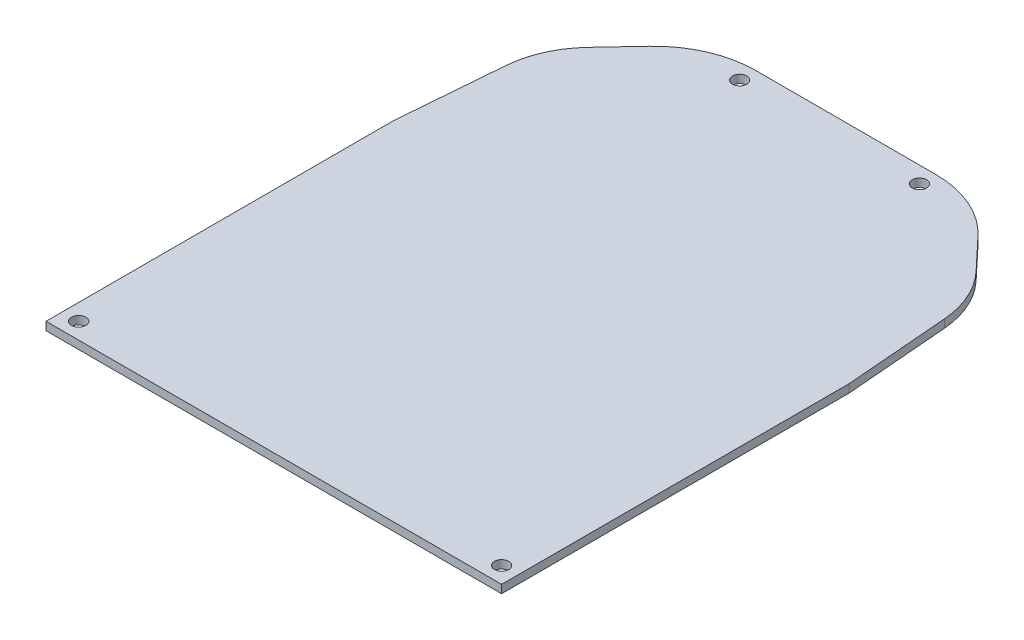
ISO-10303-21;
HEADER;
FILE_DESCRIPTION(('STEP AP214'),'2;1');
FILE_NAME('part.step','',(''),(''),'','','');
FILE_SCHEMA(('AUTOMOTIVE_DESIGN { 1 0 10303 214 1 1 1 1 }'));
ENDSEC;
DATA;
#1=APPLICATION_CONTEXT('core data for automotive mechanical design processes');
#2=APPLICATION_PROTOCOL_DEFINITION('international standard','automotive_design',2000,#1);
#3=PRODUCT_CONTEXT('',#1,'mechanical');
#4=PRODUCT('Part','Part','',(#3));
#5=PRODUCT_RELATED_PRODUCT_CATEGORY('part','',(#4));
#6=PRODUCT_DEFINITION_FORMATION('','',#4);
#7=PRODUCT_DEFINITION_CONTEXT('part definition',#1,'design');
#8=PRODUCT_DEFINITION('design','',#6,#7);
#9=PRODUCT_DEFINITION_SHAPE('','',#8);
#10=(LENGTH_UNIT() NAMED_UNIT(*) SI_UNIT(.MILLI.,.METRE.));
#11=(NAMED_UNIT(*) PLANE_ANGLE_UNIT() SI_UNIT($,.RADIAN.));
#12=(NAMED_UNIT(*) SI_UNIT($,.STERADIAN.) SOLID_ANGLE_UNIT());
#13=UNCERTAINTY_MEASURE_WITH_UNIT(LENGTH_MEASURE(1.E-05),#10,'distance_accuracy_value','');
#14=(GEOMETRIC_REPRESENTATION_CONTEXT(3) GLOBAL_UNCERTAINTY_ASSIGNED_CONTEXT((#13)) GLOBAL_UNIT_ASSIGNED_CONTEXT((#10,
#11,#12)) REPRESENTATION_CONTEXT('',''));
#15=CARTESIAN_POINT('',(0.,0.,0.));
#16=DIRECTION('',(0.,0.,1.));
#17=DIRECTION('',(1.,0.,0.));
#18=AXIS2_PLACEMENT_3D('',#15,#16,#17);
#19=CARTESIAN_POINT('',(-52.3564557576918,2.,-49.20418799964));
#20=DIRECTION('',(0.728703237176436,0.,0.684829608098674));
#21=DIRECTION('',(0.684829608098674,0.,-0.728703237176436));
#22=AXIS2_PLACEMENT_3D('',#19,#20,#21);
#23=PLANE('',#22);
#24=DIRECTION('',(-0.684829608098674,0.,0.728703237176436));
#25=VECTOR('',#24,1.);
#26=CARTESIAN_POINT('',(-52.3564557576918,0.,-49.20418799964));
#27=LINE('',#26,#25);
#28=CARTESIAN_POINT('',(-40.2175809294112,0.,-62.1207402024664));
#29=VERTEX_POINT('',#28);
#30=CARTESIAN_POINT('',(-47.510174455058,0.,-54.3609464571219));
#31=VERTEX_POINT('',#30);
#32=EDGE_CURVE('E172',#29,#31,#27,.T.);
#33=ORIENTED_EDGE('',*,*,#32,.T.);
#34=DIRECTION('',(0.,-1.,0.));
#35=VECTOR('',#34,1.);
#36=CARTESIAN_POINT('',(-47.510174455058,2.,-54.3609464571219));
#37=LINE('',#36,#35);
#38=CARTESIAN_POINT('',(-47.510174455058,2.,-54.3609464571219));
#39=VERTEX_POINT('',#38);
#40=EDGE_CURVE('E11',#39,#31,#37,.T.);
#41=ORIENTED_EDGE('',*,*,#40,.F.);
#42=DIRECTION('',(-0.684829608098674,0.,0.728703237176436));
#43=VECTOR('',#42,1.);
#44=CARTESIAN_POINT('',(-52.3564557576918,2.,-49.20418799964));
#45=LINE('',#44,#43);
#46=CARTESIAN_POINT('',(-40.2175809294112,2.,-62.1207402024664));
#47=VERTEX_POINT('',#46);
#48=EDGE_CURVE('E268',#47,#39,#45,.T.);
#49=ORIENTED_EDGE('',*,*,#48,.F.);
#50=DIRECTION('',(0.,-1.,0.));
#51=VECTOR('',#50,1.);
#52=CARTESIAN_POINT('',(-40.2175809294112,2.,-62.1207402024664));
#53=LINE('',#52,#51);
#54=EDGE_CURVE('E165',#47,#29,#53,.T.);
#55=ORIENTED_EDGE('',*,*,#54,.T.);
#56=EDGE_LOOP('',(#33,#41,#49,#55));
#57=FACE_BOUND('',#56,.T.);
#58=ADVANCED_FACE('F38',(#57),#23,.F.);
#59=CARTESIAN_POINT('',(-30.7500000000001,2.,-38.6098654708518));
#60=DIRECTION('',(0.,-1.,0.));
#61=DIRECTION('',(0.,0.,-1.));
#62=AXIS2_PLACEMENT_3D('',#59,#60,#61);
#63=CYLINDRICAL_SURFACE('',#62,23.0000000000002);
#64=CARTESIAN_POINT('',(-30.7500000000001,0.,-38.6098654708518));
#65=DIRECTION('',(0.,1.,0.));
#66=DIRECTION('',(0.,0.,1.));
#67=AXIS2_PLACEMENT_3D('',#64,#65,#66);
#68=CIRCLE('',#67,23.0000000000002);
#69=CARTESIAN_POINT('',(-53.6740263210606,0.,-40.4777565895551));
#70=VERTEX_POINT('',#69);
#71=EDGE_CURVE('E175',#31,#70,#68,.T.);
#72=ORIENTED_EDGE('',*,*,#71,.T.);
#73=DIRECTION('',(0.,-1.,0.));
#74=VECTOR('',#73,1.);
#75=CARTESIAN_POINT('',(-53.6740263210606,2.,-40.4777565895551));
#76=LINE('',#75,#74);
#77=CARTESIAN_POINT('',(-53.6740263210606,2.,-40.4777565895551));
#78=VERTEX_POINT('',#77);
#79=EDGE_CURVE('E47',#78,#70,#76,.T.);
#80=ORIENTED_EDGE('',*,*,#79,.F.);
#81=CARTESIAN_POINT('',(-30.7500000000001,2.,-38.6098654708518));
#82=DIRECTION('',(0.,1.,0.));
#83=DIRECTION('',(0.,0.,1.));
#84=AXIS2_PLACEMENT_3D('',#81,#82,#83);
#85=CIRCLE('',#84,23.0000000000002);
#86=EDGE_CURVE('E110',#39,#78,#85,.T.);
#87=ORIENTED_EDGE('',*,*,#86,.F.);
#88=ORIENTED_EDGE('',*,*,#40,.T.);
#89=EDGE_LOOP('',(#72,#80,#87,#88));
#90=FACE_BOUND('',#89,.T.);
#91=ADVANCED_FACE('F283',(#90),#63,.T.);
#92=CARTESIAN_POINT('',(-56.5964670451986,2.,-4.61158247958299));
#93=DIRECTION('',(0.996696796567843,0.,0.0812126573349192));
#94=DIRECTION('',(0.0812126573349192,0.,-0.996696796567843));
#95=AXIS2_PLACEMENT_3D('',#92,#93,#94);
#96=PLANE('',#95);
#97=DIRECTION('',(-0.0812126573349192,0.,0.996696796567843));
#98=VECTOR('',#97,1.);
#99=CARTESIAN_POINT('',(-56.5964670451986,0.,-4.61158247958299));
#100=LINE('',#99,#98);
#101=CARTESIAN_POINT('',(-55.75,0.,-15.0000000001471));
#102=VERTEX_POINT('',#101);
#103=EDGE_CURVE('E177',#70,#102,#100,.T.);
#104=ORIENTED_EDGE('',*,*,#103,.T.);
#105=DIRECTION('',(0.,-1.,0.));
#106=VECTOR('',#105,1.);
#107=CARTESIAN_POINT('',(-55.75,2.,-15.0000000001471));
#108=LINE('',#107,#106);
#109=CARTESIAN_POINT('',(-55.75,2.,-15.0000000001471));
#110=VERTEX_POINT('',#109);
#111=EDGE_CURVE('E219',#110,#102,#108,.T.);
#112=ORIENTED_EDGE('',*,*,#111,.F.);
#113=DIRECTION('',(-0.0812126573349192,0.,0.996696796567843));
#114=VECTOR('',#113,1.);
#115=CARTESIAN_POINT('',(-56.5964670451986,2.,-4.61158247958299));
#116=LINE('',#115,#114);
#117=EDGE_CURVE('E227',#78,#110,#116,.T.);
#118=ORIENTED_EDGE('',*,*,#117,.F.);
#119=ORIENTED_EDGE('',*,*,#79,.T.);
#120=EDGE_LOOP('',(#104,#112,#118,#119));
#121=FACE_BOUND('',#120,.T.);
#122=ADVANCED_FACE('F225',(#121),#96,.F.);
#123=CARTESIAN_POINT('',(-55.75,2.,0.));
#124=DIRECTION('',(1.,0.,0.));
#125=DIRECTION('',(0.,0.,-1.));
#126=AXIS2_PLACEMENT_3D('',#123,#124,#125);
#127=PLANE('',#126);
#128=DIRECTION('',(0.,0.,1.));
#129=VECTOR('',#128,1.);
#130=CARTESIAN_POINT('',(-55.75,0.,0.));
#131=LINE('',#130,#129);
#132=CARTESIAN_POINT('',(-55.75,0.,69.9999999999999));
#133=VERTEX_POINT('',#132);
#134=EDGE_CURVE('E179',#102,#133,#131,.T.);
#135=ORIENTED_EDGE('',*,*,#134,.T.);
#136=DIRECTION('',(0.,-1.,0.));
#137=VECTOR('',#136,1.);
#138=CARTESIAN_POINT('',(-55.75,2.,69.9999999999999));
#139=LINE('',#138,#137);
#140=CARTESIAN_POINT('',(-55.75,2.,69.9999999999999));
#141=VERTEX_POINT('',#140);
#142=EDGE_CURVE('E216',#141,#133,#139,.T.);
#143=ORIENTED_EDGE('',*,*,#142,.F.);
#144=DIRECTION('',(0.,0.,1.));
#145=VECTOR('',#144,1.);
#146=CARTESIAN_POINT('',(-55.75,2.,0.));
#147=LINE('',#146,#145);
#148=EDGE_CURVE('E246',#110,#141,#147,.T.);
#149=ORIENTED_EDGE('',*,*,#148,.F.);
#150=ORIENTED_EDGE('',*,*,#111,.T.);
#151=EDGE_LOOP('',(#135,#143,#149,#150));
#152=FACE_BOUND('',#151,.T.);
#153=ADVANCED_FACE('F237',(#152),#127,.F.);
#154=CARTESIAN_POINT('',(0.,2.,69.9999999999999));
#155=DIRECTION('',(0.,0.,-1.));
#156=DIRECTION('',(-1.,0.,0.));
#157=AXIS2_PLACEMENT_3D('',#154,#155,#156);
#158=PLANE('',#157);
#159=DIRECTION('',(1.,0.,0.));
#160=VECTOR('',#159,1.);
#161=CARTESIAN_POINT('',(0.,0.,69.9999999999999));
#162=LINE('',#161,#160);
#163=CARTESIAN_POINT('',(55.75,0.,69.9999999999999));
#164=VERTEX_POINT('',#163);
#165=EDGE_CURVE('E181',#133,#164,#162,.T.);
#166=ORIENTED_EDGE('',*,*,#165,.T.);
#167=DIRECTION('',(0.,-1.,0.));
#168=VECTOR('',#167,1.);
#169=CARTESIAN_POINT('',(55.75,2.,69.9999999999999));
#170=LINE('',#169,#168);
#171=CARTESIAN_POINT('',(55.75,2.,69.9999999999999));
#172=VERTEX_POINT('',#171);
#173=EDGE_CURVE('E213',#172,#164,#170,.T.);
#174=ORIENTED_EDGE('',*,*,#173,.F.);
#175=DIRECTION('',(1.,0.,0.));
#176=VECTOR('',#175,1.);
#177=CARTESIAN_POINT('',(0.,2.,69.9999999999999));
#178=LINE('',#177,#176);
#179=EDGE_CURVE('E243',#141,#172,#178,.T.);
#180=ORIENTED_EDGE('',*,*,#179,.F.);
#181=ORIENTED_EDGE('',*,*,#142,.T.);
#182=EDGE_LOOP('',(#166,#174,#180,#181));
#183=FACE_BOUND('',#182,.T.);
#184=ADVANCED_FACE('F241',(#183),#158,.F.);
#185=CARTESIAN_POINT('',(55.75,2.,0.));
#186=DIRECTION('',(-1.,0.,0.));
#187=DIRECTION('',(0.,0.,1.));
#188=AXIS2_PLACEMENT_3D('',#185,#186,#187);
#189=PLANE('',#188);
#190=DIRECTION('',(0.,0.,-1.));
#191=VECTOR('',#190,1.);
#192=CARTESIAN_POINT('',(55.75,0.,0.));
#193=LINE('',#192,#191);
#194=CARTESIAN_POINT('',(55.75,0.,-15.000000000147));
#195=VERTEX_POINT('',#194);
#196=EDGE_CURVE('E183',#164,#195,#193,.T.);
#197=ORIENTED_EDGE('',*,*,#196,.T.);
#198=DIRECTION('',(0.,-1.,0.));
#199=VECTOR('',#198,1.);
#200=CARTESIAN_POINT('',(55.75,2.,-15.000000000147));
#201=LINE('',#200,#199);
#202=CARTESIAN_POINT('',(55.75,2.,-15.000000000147));
#203=VERTEX_POINT('',#202);
#204=EDGE_CURVE('E210',#203,#195,#201,.T.);
#205=ORIENTED_EDGE('',*,*,#204,.F.);
#206=DIRECTION('',(0.,0.,-1.));
#207=VECTOR('',#206,1.);
#208=CARTESIAN_POINT('',(55.75,2.,0.));
#209=LINE('',#208,#207);
#210=EDGE_CURVE('E245',#172,#203,#209,.T.);
#211=ORIENTED_EDGE('',*,*,#210,.F.);
#212=ORIENTED_EDGE('',*,*,#173,.T.);
#213=EDGE_LOOP('',(#197,#205,#211,#212));
#214=FACE_BOUND('',#213,.T.);
#215=ADVANCED_FACE('F296',(#214),#189,.F.);
#216=CARTESIAN_POINT('',(56.5964670451985,2.,-4.61158247958297));
#217=DIRECTION('',(-0.996696796567843,0.,0.0812126573349188));
#218=DIRECTION('',(0.0812126573349189,0.,0.996696796567844));
#219=AXIS2_PLACEMENT_3D('',#216,#217,#218);
#220=PLANE('',#219);
#221=DIRECTION('',(-0.0812126573349189,0.,-0.996696796567844));
#222=VECTOR('',#221,1.);
#223=CARTESIAN_POINT('',(56.5964670451985,0.,-4.61158247958297));
#224=LINE('',#223,#222);
#225=CARTESIAN_POINT('',(53.6740263210606,0.,-40.4777565895551));
#226=VERTEX_POINT('',#225);
#227=EDGE_CURVE('E185',#195,#226,#224,.T.);
#228=ORIENTED_EDGE('',*,*,#227,.T.);
#229=DIRECTION('',(0.,-1.,0.));
#230=VECTOR('',#229,1.);
#231=CARTESIAN_POINT('',(53.6740263210606,2.,-40.4777565895551));
#232=LINE('',#231,#230);
#233=CARTESIAN_POINT('',(53.6740263210606,2.,-40.4777565895551));
#234=VERTEX_POINT('',#233);
#235=EDGE_CURVE('E207',#234,#226,#232,.T.);
#236=ORIENTED_EDGE('',*,*,#235,.F.);
#237=DIRECTION('',(-0.0812126573349189,0.,-0.996696796567844));
#238=VECTOR('',#237,1.);
#239=CARTESIAN_POINT('',(56.5964670451985,2.,-4.61158247958297));
#240=LINE('',#239,#238);
#241=EDGE_CURVE('E248',#203,#234,#240,.T.);
#242=ORIENTED_EDGE('',*,*,#241,.F.);
#243=ORIENTED_EDGE('',*,*,#204,.T.);
#244=EDGE_LOOP('',(#228,#236,#242,#243));
#245=FACE_BOUND('',#244,.T.);
#246=ADVANCED_FACE('F299',(#245),#220,.F.);
#247=CARTESIAN_POINT('',(30.7499999999991,2.,-38.6098654708517));
#248=DIRECTION('',(0.,-1.,0.));
#249=DIRECTION('',(0.,0.,-1.));
#250=AXIS2_PLACEMENT_3D('',#247,#248,#249);
#251=CYLINDRICAL_SURFACE('',#250,23.0000000000011);
#252=CARTESIAN_POINT('',(30.7499999999991,0.,-38.6098654708517));
#253=DIRECTION('',(0.,1.,0.));
#254=DIRECTION('',(0.,0.,1.));
#255=AXIS2_PLACEMENT_3D('',#252,#253,#254);
#256=CIRCLE('',#255,23.0000000000011);
#257=CARTESIAN_POINT('',(47.510174455058,0.,-54.3609464571219));
#258=VERTEX_POINT('',#257);
#259=EDGE_CURVE('E187',#226,#258,#256,.T.);
#260=ORIENTED_EDGE('',*,*,#259,.T.);
#261=DIRECTION('',(0.,-1.,0.));
#262=VECTOR('',#261,1.);
#263=CARTESIAN_POINT('',(47.510174455058,2.,-54.3609464571219));
#264=LINE('',#263,#262);
#265=CARTESIAN_POINT('',(47.510174455058,2.,-54.3609464571219));
#266=VERTEX_POINT('',#265);
#267=EDGE_CURVE('E204',#266,#258,#264,.T.);
#268=ORIENTED_EDGE('',*,*,#267,.F.);
#269=CARTESIAN_POINT('',(30.7499999999991,2.,-38.6098654708517));
#270=DIRECTION('',(0.,1.,0.));
#271=DIRECTION('',(0.,0.,1.));
#272=AXIS2_PLACEMENT_3D('',#269,#270,#271);
#273=CIRCLE('',#272,23.0000000000011);
#274=EDGE_CURVE('E254',#234,#266,#273,.T.);
#275=ORIENTED_EDGE('',*,*,#274,.F.);
#276=ORIENTED_EDGE('',*,*,#235,.T.);
#277=EDGE_LOOP('',(#260,#268,#275,#276));
#278=FACE_BOUND('',#277,.T.);
#279=ADVANCED_FACE('F260',(#278),#251,.T.);
#280=CARTESIAN_POINT('',(52.3564557576921,2.,-49.2041879996396));
#281=DIRECTION('',(-0.72870323717644,0.,0.684829608098669));
#282=DIRECTION('',(0.684829608098669,0.,0.72870323717644));
#283=AXIS2_PLACEMENT_3D('',#280,#281,#282);
#284=PLANE('',#283);
#285=DIRECTION('',(-0.684829608098669,0.,-0.72870323717644));
#286=VECTOR('',#285,1.);
#287=CARTESIAN_POINT('',(52.3564557576921,0.,-49.2041879996396));
#288=LINE('',#287,#286);
#289=CARTESIAN_POINT('',(40.2175809294109,0.,-62.1207402024667));
#290=VERTEX_POINT('',#289);
#291=EDGE_CURVE('E189',#258,#290,#288,.T.);
#292=ORIENTED_EDGE('',*,*,#291,.T.);
#293=DIRECTION('',(0.,-1.,0.));
#294=VECTOR('',#293,1.);
#295=CARTESIAN_POINT('',(40.2175809294109,2.,-62.1207402024667));
#296=LINE('',#295,#294);
#297=CARTESIAN_POINT('',(40.2175809294109,2.,-62.1207402024667));
#298=VERTEX_POINT('',#297);
#299=EDGE_CURVE('E151',#298,#290,#296,.T.);
#300=ORIENTED_EDGE('',*,*,#299,.F.);
#301=DIRECTION('',(-0.684829608098669,0.,-0.72870323717644));
#302=VECTOR('',#301,1.);
#303=CARTESIAN_POINT('',(52.3564557576921,2.,-49.2041879996396));
#304=LINE('',#303,#302);
#305=EDGE_CURVE('E142',#266,#298,#304,.T.);
#306=ORIENTED_EDGE('',*,*,#305,.F.);
#307=ORIENTED_EDGE('',*,*,#267,.T.);
#308=EDGE_LOOP('',(#292,#300,#306,#307));
#309=FACE_BOUND('',#308,.T.);
#310=ADVANCED_FACE('F264',(#309),#284,.F.);
#311=CARTESIAN_POINT('',(22.,2.,-45.));
#312=DIRECTION('',(0.,-1.,0.));
#313=DIRECTION('',(0.,0.,-1.));
#314=AXIS2_PLACEMENT_3D('',#311,#312,#313);
#315=CYLINDRICAL_SURFACE('',#314,25.);
#316=CARTESIAN_POINT('',(22.,0.,-45.));
#317=DIRECTION('',(0.,1.,0.));
#318=DIRECTION('',(0.,0.,1.));
#319=AXIS2_PLACEMENT_3D('',#316,#317,#318);
#320=CIRCLE('',#319,25.);
#321=CARTESIAN_POINT('',(22.,0.,-70.));
#322=VERTEX_POINT('',#321);
#323=EDGE_CURVE('E150',#290,#322,#320,.T.);
#324=ORIENTED_EDGE('',*,*,#323,.T.);
#325=DIRECTION('',(0.,-1.,0.));
#326=VECTOR('',#325,1.);
#327=CARTESIAN_POINT('',(22.,2.,-70.));
#328=LINE('',#327,#326);
#329=CARTESIAN_POINT('',(22.,2.,-70.));
#330=VERTEX_POINT('',#329);
#331=EDGE_CURVE('E147',#330,#322,#328,.T.);
#332=ORIENTED_EDGE('',*,*,#331,.F.);
#333=CARTESIAN_POINT('',(22.,2.,-45.));
#334=DIRECTION('',(0.,1.,0.));
#335=DIRECTION('',(0.,0.,1.));
#336=AXIS2_PLACEMENT_3D('',#333,#334,#335);
#337=CIRCLE('',#336,25.);
#338=EDGE_CURVE('E135',#298,#330,#337,.T.);
#339=ORIENTED_EDGE('',*,*,#338,.F.);
#340=ORIENTED_EDGE('',*,*,#299,.T.);
#341=EDGE_LOOP('',(#324,#332,#339,#340));
#342=FACE_BOUND('',#341,.T.);
#343=ADVANCED_FACE('F148',(#342),#315,.T.);
#344=CARTESIAN_POINT('',(0.,2.,-70.));
#345=DIRECTION('',(0.,0.,1.));
#346=DIRECTION('',(1.,0.,0.));
#347=AXIS2_PLACEMENT_3D('',#344,#345,#346);
#348=PLANE('',#347);
#349=DIRECTION('',(-1.,0.,0.));
#350=VECTOR('',#349,1.);
#351=CARTESIAN_POINT('',(0.,0.,-70.));
#352=LINE('',#351,#350);
#353=CARTESIAN_POINT('',(-21.9999999999998,0.,-70.));
#354=VERTEX_POINT('',#353);
#355=EDGE_CURVE('E96',#322,#354,#352,.T.);
#356=ORIENTED_EDGE('',*,*,#355,.T.);
#357=DIRECTION('',(0.,-1.,0.));
#358=VECTOR('',#357,1.);
#359=CARTESIAN_POINT('',(-21.9999999999998,2.,-70.));
#360=LINE('',#359,#358);
#361=CARTESIAN_POINT('',(-21.9999999999998,2.,-70.));
#362=VERTEX_POINT('',#361);
#363=EDGE_CURVE('E152',#362,#354,#360,.T.);
#364=ORIENTED_EDGE('',*,*,#363,.F.);
#365=DIRECTION('',(-1.,0.,0.));
#366=VECTOR('',#365,1.);
#367=CARTESIAN_POINT('',(0.,2.,-70.));
#368=LINE('',#367,#366);
#369=EDGE_CURVE('E140',#330,#362,#368,.T.);
#370=ORIENTED_EDGE('',*,*,#369,.F.);
#371=ORIENTED_EDGE('',*,*,#331,.T.);
#372=EDGE_LOOP('',(#356,#364,#370,#371));
#373=FACE_BOUND('',#372,.T.);
#374=ADVANCED_FACE('F154',(#373),#348,.F.);
#375=CARTESIAN_POINT('',(-51.75,2.,66.));
#376=DIRECTION('',(0.,-1.,0.));
#377=DIRECTION('',(0.,0.,-1.));
#378=AXIS2_PLACEMENT_3D('',#375,#376,#377);
#379=CYLINDRICAL_SURFACE('',#378,1.75);
#380=CARTESIAN_POINT('',(-51.75,2.,66.));
#381=DIRECTION('',(0.,1.,0.));
#382=DIRECTION('',(0.,0.,1.));
#383=AXIS2_PLACEMENT_3D('',#380,#381,#382);
#384=CIRCLE('',#383,1.75);
#385=CARTESIAN_POINT('',(-51.75,2.,67.75));
#386=VERTEX_POINT('',#385);
#387=EDGE_CURVE('E156',#386,#386,#384,.T.);
#388=ORIENTED_EDGE('',*,*,#387,.T.);
#389=EDGE_LOOP('',(#388));
#390=FACE_BOUND('',#389,.T.);
#391=CARTESIAN_POINT('',(-51.75,0.,66.));
#392=DIRECTION('',(0.,1.,0.));
#393=DIRECTION('',(0.,0.,1.));
#394=AXIS2_PLACEMENT_3D('',#391,#392,#393);
#395=CIRCLE('',#394,1.75);
#396=CARTESIAN_POINT('',(-51.75,0.,67.75));
#397=VERTEX_POINT('',#396);
#398=EDGE_CURVE('E194',#397,#397,#395,.T.);
#399=ORIENTED_EDGE('',*,*,#398,.F.);
#400=EDGE_LOOP('',(#399));
#401=FACE_BOUND('',#400,.T.);
#402=ADVANCED_FACE('F272',(#390,#401),#379,.F.);
#403=CARTESIAN_POINT('',(-21.9999999999998,2.,-44.9999999999999));
#404=DIRECTION('',(0.,-1.,0.));
#405=DIRECTION('',(0.,0.,-1.));
#406=AXIS2_PLACEMENT_3D('',#403,#404,#405);
#407=CYLINDRICAL_SURFACE('',#406,25.0000000000001);
#408=CARTESIAN_POINT('',(-21.9999999999998,0.,-44.9999999999999));
#409=DIRECTION('',(0.,1.,0.));
#410=DIRECTION('',(0.,0.,1.));
#411=AXIS2_PLACEMENT_3D('',#408,#409,#410);
#412=CIRCLE('',#411,25.0000000000001);
#413=EDGE_CURVE('E102',#354,#29,#412,.T.);
#414=ORIENTED_EDGE('',*,*,#413,.T.);
#415=ORIENTED_EDGE('',*,*,#54,.F.);
#416=CARTESIAN_POINT('',(-21.9999999999998,2.,-44.9999999999999));
#417=DIRECTION('',(0.,1.,0.));
#418=DIRECTION('',(0.,0.,1.));
#419=AXIS2_PLACEMENT_3D('',#416,#417,#418);
#420=CIRCLE('',#419,25.0000000000001);
#421=EDGE_CURVE('E55',#362,#47,#420,.T.);
#422=ORIENTED_EDGE('',*,*,#421,.F.);
#423=ORIENTED_EDGE('',*,*,#363,.T.);
#424=EDGE_LOOP('',(#414,#415,#422,#423));
#425=FACE_BOUND('',#424,.T.);
#426=ADVANCED_FACE('F269',(#425),#407,.T.);
#427=CARTESIAN_POINT('',(-22.,2.,-66.));
#428=DIRECTION('',(0.,-1.,0.));
#429=DIRECTION('',(0.,0.,-1.));
#430=AXIS2_PLACEMENT_3D('',#427,#428,#429);
#431=CYLINDRICAL_SURFACE('',#430,1.75);
#432=CARTESIAN_POINT('',(-22.,2.,-66.));
#433=DIRECTION('',(0.,1.,0.));
#434=DIRECTION('',(0.,0.,1.));
#435=AXIS2_PLACEMENT_3D('',#432,#433,#434);
#436=CIRCLE('',#435,1.75);
#437=CARTESIAN_POINT('',(-22.,2.,-64.25));
#438=VERTEX_POINT('',#437);
#439=EDGE_CURVE('E384',#438,#438,#436,.T.);
#440=ORIENTED_EDGE('',*,*,#439,.T.);
#441=EDGE_LOOP('',(#440));
#442=FACE_BOUND('',#441,.T.);
#443=CARTESIAN_POINT('',(-22.,0.,-66.));
#444=DIRECTION('',(0.,1.,0.));
#445=DIRECTION('',(0.,0.,1.));
#446=AXIS2_PLACEMENT_3D('',#443,#444,#445);
#447=CIRCLE('',#446,1.75);
#448=CARTESIAN_POINT('',(-22.,0.,-64.25));
#449=VERTEX_POINT('',#448);
#450=EDGE_CURVE('E169',#449,#449,#447,.T.);
#451=ORIENTED_EDGE('',*,*,#450,.F.);
#452=EDGE_LOOP('',(#451));
#453=FACE_BOUND('',#452,.T.);
#454=ADVANCED_FACE('F271',(#442,#453),#431,.F.);
#455=CARTESIAN_POINT('',(22.,2.,-66.));
#456=DIRECTION('',(0.,-1.,0.));
#457=DIRECTION('',(0.,0.,-1.));
#458=AXIS2_PLACEMENT_3D('',#455,#456,#457);
#459=CYLINDRICAL_SURFACE('',#458,1.75);
#460=CARTESIAN_POINT('',(22.,2.,-66.));
#461=DIRECTION('',(0.,1.,0.));
#462=DIRECTION('',(0.,0.,1.));
#463=AXIS2_PLACEMENT_3D('',#460,#461,#462);
#464=CIRCLE('',#463,1.75);
#465=CARTESIAN_POINT('',(22.,2.,-64.25));
#466=VERTEX_POINT('',#465);
#467=EDGE_CURVE('E200',#466,#466,#464,.T.);
#468=ORIENTED_EDGE('',*,*,#467,.T.);
#469=EDGE_LOOP('',(#468));
#470=FACE_BOUND('',#469,.T.);
#471=CARTESIAN_POINT('',(22.,0.,-66.));
#472=DIRECTION('',(0.,1.,0.));
#473=DIRECTION('',(0.,0.,1.));
#474=AXIS2_PLACEMENT_3D('',#471,#472,#473);
#475=CIRCLE('',#474,1.75);
#476=CARTESIAN_POINT('',(22.,0.,-64.25));
#477=VERTEX_POINT('',#476);
#478=EDGE_CURVE('E166',#477,#477,#475,.T.);
#479=ORIENTED_EDGE('',*,*,#478,.F.);
#480=EDGE_LOOP('',(#479));
#481=FACE_BOUND('',#480,.T.);
#482=ADVANCED_FACE('F40',(#470,#481),#459,.F.);
#483=CARTESIAN_POINT('',(51.75,2.,65.9999999999999));
#484=DIRECTION('',(0.,-1.,0.));
#485=DIRECTION('',(0.,0.,-1.));
#486=AXIS2_PLACEMENT_3D('',#483,#484,#485);
#487=CYLINDRICAL_SURFACE('',#486,1.75);
#488=CARTESIAN_POINT('',(51.75,2.,65.9999999999999));
#489=DIRECTION('',(0.,1.,0.));
#490=DIRECTION('',(0.,0.,1.));
#491=AXIS2_PLACEMENT_3D('',#488,#489,#490);
#492=CIRCLE('',#491,1.75);
#493=CARTESIAN_POINT('',(51.75,2.,67.7499999999999));
#494=VERTEX_POINT('',#493);
#495=EDGE_CURVE('E162',#494,#494,#492,.T.);
#496=ORIENTED_EDGE('',*,*,#495,.T.);
#497=EDGE_LOOP('',(#496));
#498=FACE_BOUND('',#497,.T.);
#499=CARTESIAN_POINT('',(51.75,0.,65.9999999999999));
#500=DIRECTION('',(0.,1.,0.));
#501=DIRECTION('',(0.,0.,1.));
#502=AXIS2_PLACEMENT_3D('',#499,#500,#501);
#503=CIRCLE('',#502,1.75);
#504=CARTESIAN_POINT('',(51.75,0.,67.7499999999999));
#505=VERTEX_POINT('',#504);
#506=EDGE_CURVE('E197',#505,#505,#503,.T.);
#507=ORIENTED_EDGE('',*,*,#506,.F.);
#508=EDGE_LOOP('',(#507));
#509=FACE_BOUND('',#508,.T.);
#510=ADVANCED_FACE('F337',(#498,#509),#487,.F.);
#511=CARTESIAN_POINT('',(0.,2.,0.));
#512=DIRECTION('',(0.,1.,0.));
#513=DIRECTION('',(0.,0.,1.));
#514=AXIS2_PLACEMENT_3D('',#511,#512,#513);
#515=PLANE('',#514);
#516=ORIENTED_EDGE('',*,*,#467,.F.);
#517=EDGE_LOOP('',(#516));
#518=FACE_BOUND('',#517,.T.);
#519=ORIENTED_EDGE('',*,*,#439,.F.);
#520=EDGE_LOOP('',(#519));
#521=FACE_BOUND('',#520,.T.);
#522=ORIENTED_EDGE('',*,*,#48,.T.);
#523=ORIENTED_EDGE('',*,*,#86,.T.);
#524=ORIENTED_EDGE('',*,*,#117,.T.);
#525=ORIENTED_EDGE('',*,*,#148,.T.);
#526=ORIENTED_EDGE('',*,*,#179,.T.);
#527=ORIENTED_EDGE('',*,*,#210,.T.);
#528=ORIENTED_EDGE('',*,*,#241,.T.);
#529=ORIENTED_EDGE('',*,*,#274,.T.);
#530=ORIENTED_EDGE('',*,*,#305,.T.);
#531=ORIENTED_EDGE('',*,*,#338,.T.);
#532=ORIENTED_EDGE('',*,*,#369,.T.);
#533=ORIENTED_EDGE('',*,*,#421,.T.);
#534=EDGE_LOOP('',(#522,#523,#524,#525,#526,#527,#528,#529,#530,#531,#532,#533));
#535=FACE_BOUND('',#534,.T.);
#536=ORIENTED_EDGE('',*,*,#387,.F.);
#537=EDGE_LOOP('',(#536));
#538=FACE_BOUND('',#537,.T.);
#539=ORIENTED_EDGE('',*,*,#495,.F.);
#540=EDGE_LOOP('',(#539));
#541=FACE_BOUND('',#540,.T.);
#542=ADVANCED_FACE('F137',(#518,#521,#535,#538,#541),#515,.T.);
#543=CARTESIAN_POINT('',(0.,0.,0.));
#544=DIRECTION('',(0.,1.,0.));
#545=DIRECTION('',(0.,0.,1.));
#546=AXIS2_PLACEMENT_3D('',#543,#544,#545);
#547=PLANE('',#546);
#548=ORIENTED_EDGE('',*,*,#478,.T.);
#549=EDGE_LOOP('',(#548));
#550=FACE_BOUND('',#549,.T.);
#551=ORIENTED_EDGE('',*,*,#450,.T.);
#552=EDGE_LOOP('',(#551));
#553=FACE_BOUND('',#552,.T.);
#554=ORIENTED_EDGE('',*,*,#32,.F.);
#555=ORIENTED_EDGE('',*,*,#413,.F.);
#556=ORIENTED_EDGE('',*,*,#355,.F.);
#557=ORIENTED_EDGE('',*,*,#323,.F.);
#558=ORIENTED_EDGE('',*,*,#291,.F.);
#559=ORIENTED_EDGE('',*,*,#259,.F.);
#560=ORIENTED_EDGE('',*,*,#227,.F.);
#561=ORIENTED_EDGE('',*,*,#196,.F.);
#562=ORIENTED_EDGE('',*,*,#165,.F.);
#563=ORIENTED_EDGE('',*,*,#134,.F.);
#564=ORIENTED_EDGE('',*,*,#103,.F.);
#565=ORIENTED_EDGE('',*,*,#71,.F.);
#566=EDGE_LOOP('',(#554,#555,#556,#557,#558,#559,#560,#561,#562,#563,#564,#565));
#567=FACE_BOUND('',#566,.T.);
#568=ORIENTED_EDGE('',*,*,#398,.T.);
#569=EDGE_LOOP('',(#568));
#570=FACE_BOUND('',#569,.T.);
#571=ORIENTED_EDGE('',*,*,#506,.T.);
#572=EDGE_LOOP('',(#571));
#573=FACE_BOUND('',#572,.T.);
#574=ADVANCED_FACE('F231',(#550,#553,#567,#570,#573),#547,.F.);
#575=CLOSED_SHELL('',(#58,#91,#122,#153,#184,#215,#246,#279,#310,#343,#374,#402,#426,#454,#482,
#510,#542,#574));
#576=MANIFOLD_SOLID_BREP('B2',#575);
#577=ADVANCED_BREP_SHAPE_REPRESENTATION('',(#18,#576),#14);
#578=SHAPE_DEFINITION_REPRESENTATION(#9,#577);
ENDSEC;
END-ISO-10303-21;
